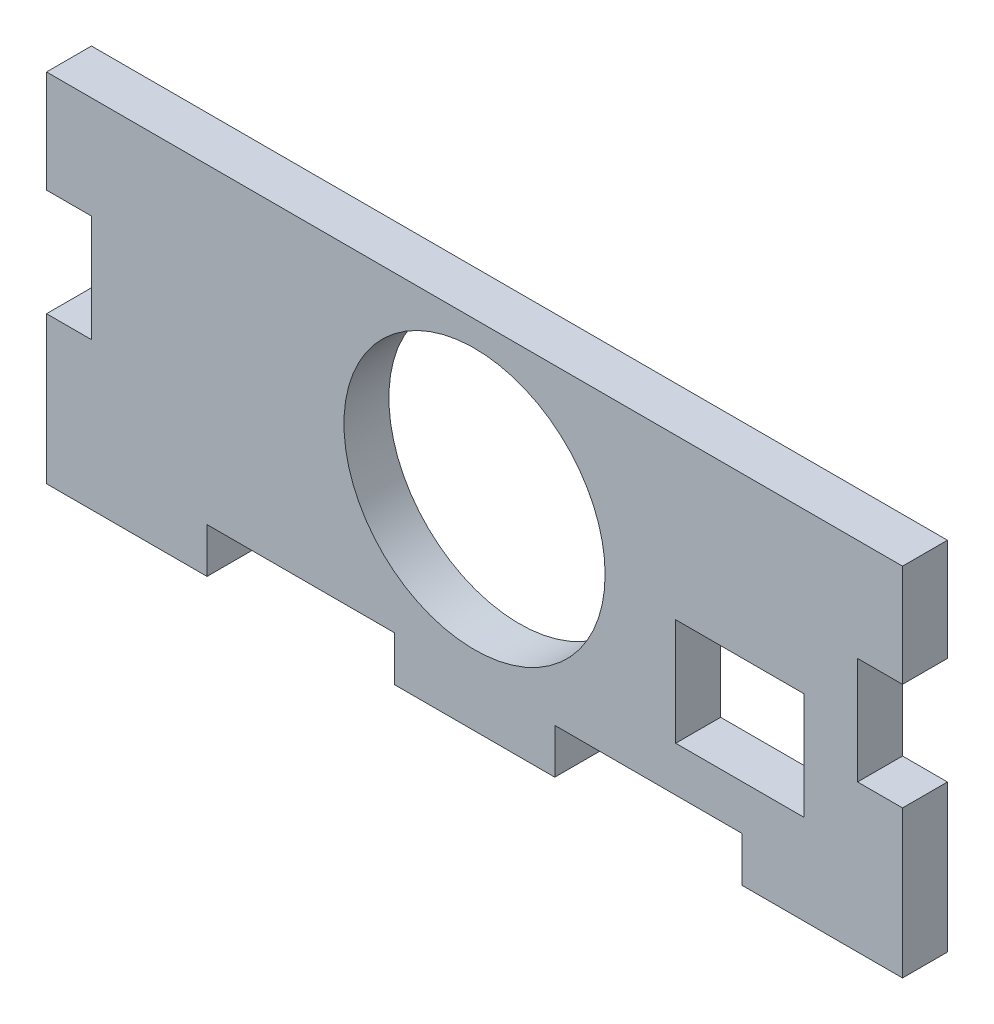
ISO-10303-21;
HEADER;
FILE_DESCRIPTION(('STEP AP214'),'2;1');
FILE_NAME('part.step','',(''),(''),'','','');
FILE_SCHEMA(('AUTOMOTIVE_DESIGN { 1 0 10303 214 1 1 1 1 }'));
ENDSEC;
DATA;
#1=APPLICATION_CONTEXT('core data for automotive mechanical design processes');
#2=APPLICATION_PROTOCOL_DEFINITION('international standard','automotive_design',2000,#1);
#3=PRODUCT_CONTEXT('',#1,'mechanical');
#4=PRODUCT('Part','Part','',(#3));
#5=PRODUCT_RELATED_PRODUCT_CATEGORY('part','',(#4));
#6=PRODUCT_DEFINITION_FORMATION('','',#4);
#7=PRODUCT_DEFINITION_CONTEXT('part definition',#1,'design');
#8=PRODUCT_DEFINITION('design','',#6,#7);
#9=PRODUCT_DEFINITION_SHAPE('','',#8);
#10=(LENGTH_UNIT() NAMED_UNIT(*) SI_UNIT(.MILLI.,.METRE.));
#11=(NAMED_UNIT(*) PLANE_ANGLE_UNIT() SI_UNIT($,.RADIAN.));
#12=(NAMED_UNIT(*) SI_UNIT($,.STERADIAN.) SOLID_ANGLE_UNIT());
#13=UNCERTAINTY_MEASURE_WITH_UNIT(LENGTH_MEASURE(1.E-05),#10,'distance_accuracy_value','');
#14=(GEOMETRIC_REPRESENTATION_CONTEXT(3) GLOBAL_UNCERTAINTY_ASSIGNED_CONTEXT((#13)) GLOBAL_UNIT_ASSIGNED_CONTEXT((#10,
#11,#12)) REPRESENTATION_CONTEXT('',''));
#15=CARTESIAN_POINT('',(0.,0.,0.));
#16=DIRECTION('',(0.,0.,1.));
#17=DIRECTION('',(1.,0.,0.));
#18=AXIS2_PLACEMENT_3D('',#15,#16,#17);
#19=CARTESIAN_POINT('',(50.8,18.5,-5.334));
#20=DIRECTION('',(1.,0.,0.));
#21=DIRECTION('',(0.,1.,0.));
#22=AXIS2_PLACEMENT_3D('',#19,#20,#21);
#23=PLANE('',#22);
#24=DIRECTION('',(0.,0.,1.));
#25=VECTOR('',#24,1.);
#26=CARTESIAN_POINT('',(50.8,6.34999999999999,-5.33405));
#27=LINE('',#26,#25);
#28=CARTESIAN_POINT('',(50.8,6.34999999999999,-5.334));
#29=VERTEX_POINT('',#28);
#30=CARTESIAN_POINT('',(50.8,6.34999999999999,0.));
#31=VERTEX_POINT('',#30);
#32=EDGE_CURVE('E221',#29,#31,#27,.T.);
#33=ORIENTED_EDGE('',*,*,#32,.F.);
#34=DIRECTION('',(0.,1.,0.));
#35=VECTOR('',#34,1.);
#36=CARTESIAN_POINT('',(50.8,18.5,-5.334));
#37=LINE('',#36,#35);
#38=CARTESIAN_POINT('',(50.8,18.5,-5.334));
#39=VERTEX_POINT('',#38);
#40=EDGE_CURVE('E355',#29,#39,#37,.T.);
#41=ORIENTED_EDGE('',*,*,#40,.T.);
#42=DIRECTION('',(0.,0.,1.));
#43=VECTOR('',#42,1.);
#44=CARTESIAN_POINT('',(50.8,18.5,-5.334));
#45=LINE('',#44,#43);
#46=CARTESIAN_POINT('',(50.8,18.5,0.));
#47=VERTEX_POINT('',#46);
#48=EDGE_CURVE('E356',#39,#47,#45,.T.);
#49=ORIENTED_EDGE('',*,*,#48,.T.);
#50=DIRECTION('',(0.,1.,0.));
#51=VECTOR('',#50,1.);
#52=CARTESIAN_POINT('',(50.8,18.5,0.));
#53=LINE('',#52,#51);
#54=EDGE_CURVE('E387',#31,#47,#53,.T.);
#55=ORIENTED_EDGE('',*,*,#54,.F.);
#56=EDGE_LOOP('',(#33,#41,#49,#55));
#57=FACE_BOUND('',#56,.T.);
#58=ADVANCED_FACE('F32',(#57),#23,.T.);
#59=CARTESIAN_POINT('',(-50.8,18.5,-5.334));
#60=DIRECTION('',(-1.,0.,0.));
#61=DIRECTION('',(0.,0.,1.));
#62=AXIS2_PLACEMENT_3D('',#59,#60,#61);
#63=PLANE('',#62);
#64=DIRECTION('',(0.,0.,1.));
#65=VECTOR('',#64,1.);
#66=CARTESIAN_POINT('',(-50.8,6.34999999999999,-5.33405));
#67=LINE('',#66,#65);
#68=CARTESIAN_POINT('',(-50.8,6.34999999999999,-5.334));
#69=VERTEX_POINT('',#68);
#70=CARTESIAN_POINT('',(-50.8,6.34999999999999,0.));
#71=VERTEX_POINT('',#70);
#72=EDGE_CURVE('E248',#69,#71,#67,.T.);
#73=ORIENTED_EDGE('',*,*,#72,.T.);
#74=DIRECTION('',(0.,-1.,0.));
#75=VECTOR('',#74,1.);
#76=CARTESIAN_POINT('',(-50.8,18.5,0.));
#77=LINE('',#76,#75);
#78=CARTESIAN_POINT('',(-50.8,18.5,0.));
#79=VERTEX_POINT('',#78);
#80=EDGE_CURVE('E344',#79,#71,#77,.T.);
#81=ORIENTED_EDGE('',*,*,#80,.F.);
#82=DIRECTION('',(0.,0.,1.));
#83=VECTOR('',#82,1.);
#84=CARTESIAN_POINT('',(-50.8,18.5,-5.334));
#85=LINE('',#84,#83);
#86=CARTESIAN_POINT('',(-50.8,18.5,-5.334));
#87=VERTEX_POINT('',#86);
#88=EDGE_CURVE('E351',#87,#79,#85,.T.);
#89=ORIENTED_EDGE('',*,*,#88,.F.);
#90=DIRECTION('',(0.,-1.,0.));
#91=VECTOR('',#90,1.);
#92=CARTESIAN_POINT('',(-50.8,18.5,-5.334));
#93=LINE('',#92,#91);
#94=EDGE_CURVE('E368',#87,#69,#93,.T.);
#95=ORIENTED_EDGE('',*,*,#94,.T.);
#96=EDGE_LOOP('',(#73,#81,#89,#95));
#97=FACE_BOUND('',#96,.T.);
#98=ADVANCED_FACE('F401',(#97),#63,.T.);
#99=CARTESIAN_POINT('',(-50.8,-18.5,-5.334));
#100=DIRECTION('',(0.,-1.,0.));
#101=DIRECTION('',(1.,0.,0.));
#102=AXIS2_PLACEMENT_3D('',#99,#100,#101);
#103=PLANE('',#102);
#104=DIRECTION('',(1.,0.,0.));
#105=VECTOR('',#104,1.);
#106=CARTESIAN_POINT('',(-50.8,-18.5,-5.334));
#107=LINE('',#106,#105);
#108=CARTESIAN_POINT('',(9.525,-18.5,-5.334));
#109=VERTEX_POINT('',#108);
#110=CARTESIAN_POINT('',(31.75,-18.5,-5.33399999999999));
#111=VERTEX_POINT('',#110);
#112=EDGE_CURVE('E345',#109,#111,#107,.T.);
#113=ORIENTED_EDGE('',*,*,#112,.T.);
#114=DIRECTION('',(0.,0.,-1.));
#115=VECTOR('',#114,1.);
#116=CARTESIAN_POINT('',(31.75,-18.5,0.));
#117=LINE('',#116,#115);
#118=CARTESIAN_POINT('',(31.75,-18.5,0.));
#119=VERTEX_POINT('',#118);
#120=EDGE_CURVE('E265',#119,#111,#117,.T.);
#121=ORIENTED_EDGE('',*,*,#120,.F.);
#122=DIRECTION('',(1.,0.,0.));
#123=VECTOR('',#122,1.);
#124=CARTESIAN_POINT('',(-50.8,-18.5,0.));
#125=LINE('',#124,#123);
#126=CARTESIAN_POINT('',(9.52499999999998,-18.5,0.));
#127=VERTEX_POINT('',#126);
#128=EDGE_CURVE('E339',#127,#119,#125,.T.);
#129=ORIENTED_EDGE('',*,*,#128,.F.);
#130=DIRECTION('',(0.,0.,1.));
#131=VECTOR('',#130,1.);
#132=CARTESIAN_POINT('',(9.525,-18.5,0.));
#133=LINE('',#132,#131);
#134=EDGE_CURVE('E288',#109,#127,#133,.T.);
#135=ORIENTED_EDGE('',*,*,#134,.F.);
#136=EDGE_LOOP('',(#113,#121,#129,#135));
#137=FACE_BOUND('',#136,.T.);
#138=ADVANCED_FACE('F442',(#137),#103,.T.);
#139=CARTESIAN_POINT('',(-31.75,-18.5,-5.334));
#140=VERTEX_POINT('',#139);
#141=CARTESIAN_POINT('',(-9.525,-18.5,-5.334));
#142=VERTEX_POINT('',#141);
#143=EDGE_CURVE('E326',#140,#142,#107,.T.);
#144=ORIENTED_EDGE('',*,*,#143,.T.);
#145=DIRECTION('',(0.,0.,-1.));
#146=VECTOR('',#145,1.);
#147=CARTESIAN_POINT('',(-9.525,-18.5,0.));
#148=LINE('',#147,#146);
#149=CARTESIAN_POINT('',(-9.525,-18.5,0.));
#150=VERTEX_POINT('',#149);
#151=EDGE_CURVE('E283',#150,#142,#148,.T.);
#152=ORIENTED_EDGE('',*,*,#151,.F.);
#153=CARTESIAN_POINT('',(-31.75,-18.5,0.));
#154=VERTEX_POINT('',#153);
#155=EDGE_CURVE('E343',#154,#150,#125,.T.);
#156=ORIENTED_EDGE('',*,*,#155,.F.);
#157=DIRECTION('',(0.,0.,1.));
#158=VECTOR('',#157,1.);
#159=CARTESIAN_POINT('',(-31.75,-18.5,0.));
#160=LINE('',#159,#158);
#161=EDGE_CURVE('E306',#140,#154,#160,.T.);
#162=ORIENTED_EDGE('',*,*,#161,.F.);
#163=EDGE_LOOP('',(#144,#152,#156,#162));
#164=FACE_BOUND('',#163,.T.);
#165=ADVANCED_FACE('F428',(#164),#103,.T.);
#166=DIRECTION('',(0.,0.,1.));
#167=VECTOR('',#166,1.);
#168=CARTESIAN_POINT('',(50.8,-6.35,-5.33405));
#169=LINE('',#168,#167);
#170=CARTESIAN_POINT('',(50.8,-6.35,-5.334));
#171=VERTEX_POINT('',#170);
#172=CARTESIAN_POINT('',(50.8,-6.35,0.));
#173=VERTEX_POINT('',#172);
#174=EDGE_CURVE('E224',#171,#173,#169,.T.);
#175=ORIENTED_EDGE('',*,*,#174,.T.);
#176=CARTESIAN_POINT('',(50.8,-23.834,0.));
#177=VERTEX_POINT('',#176);
#178=EDGE_CURVE('E383',#177,#173,#53,.T.);
#179=ORIENTED_EDGE('',*,*,#178,.F.);
#180=DIRECTION('',(0.,0.,1.));
#181=VECTOR('',#180,1.);
#182=CARTESIAN_POINT('',(50.8,-23.834,0.));
#183=LINE('',#182,#181);
#184=CARTESIAN_POINT('',(50.8,-23.834,-5.33399999999999));
#185=VERTEX_POINT('',#184);
#186=EDGE_CURVE('E274',#185,#177,#183,.T.);
#187=ORIENTED_EDGE('',*,*,#186,.F.);
#188=EDGE_CURVE('E454',#185,#171,#37,.T.);
#189=ORIENTED_EDGE('',*,*,#188,.T.);
#190=EDGE_LOOP('',(#175,#179,#187,#189));
#191=FACE_BOUND('',#190,.T.);
#192=ADVANCED_FACE('F34',(#191),#23,.T.);
#193=DIRECTION('',(0.,0.,1.));
#194=VECTOR('',#193,1.);
#195=CARTESIAN_POINT('',(-50.8,-6.35,-5.33405));
#196=LINE('',#195,#194);
#197=CARTESIAN_POINT('',(-50.8,-6.35,-5.334));
#198=VERTEX_POINT('',#197);
#199=CARTESIAN_POINT('',(-50.8,-6.35,0.));
#200=VERTEX_POINT('',#199);
#201=EDGE_CURVE('E247',#198,#200,#196,.T.);
#202=ORIENTED_EDGE('',*,*,#201,.F.);
#203=CARTESIAN_POINT('',(-50.8,-23.834,-5.334));
#204=VERTEX_POINT('',#203);
#205=EDGE_CURVE('E374',#198,#204,#93,.T.);
#206=ORIENTED_EDGE('',*,*,#205,.T.);
#207=DIRECTION('',(0.,0.,-1.));
#208=VECTOR('',#207,1.);
#209=CARTESIAN_POINT('',(-50.8,-23.834,0.));
#210=LINE('',#209,#208);
#211=CARTESIAN_POINT('',(-50.8,-23.834,0.));
#212=VERTEX_POINT('',#211);
#213=EDGE_CURVE('E307',#212,#204,#210,.T.);
#214=ORIENTED_EDGE('',*,*,#213,.F.);
#215=EDGE_CURVE('E389',#200,#212,#77,.T.);
#216=ORIENTED_EDGE('',*,*,#215,.F.);
#217=EDGE_LOOP('',(#202,#206,#214,#216));
#218=FACE_BOUND('',#217,.T.);
#219=ADVANCED_FACE('F418',(#218),#63,.T.);
#220=CARTESIAN_POINT('',(-50.8,18.5,-5.334));
#221=DIRECTION('',(0.,1.,0.));
#222=DIRECTION('',(0.,0.,1.));
#223=AXIS2_PLACEMENT_3D('',#220,#221,#222);
#224=PLANE('',#223);
#225=DIRECTION('',(-1.,0.,0.));
#226=VECTOR('',#225,1.);
#227=CARTESIAN_POINT('',(-50.8,18.5,0.));
#228=LINE('',#227,#226);
#229=EDGE_CURVE('E386',#47,#79,#228,.T.);
#230=ORIENTED_EDGE('',*,*,#229,.F.);
#231=ORIENTED_EDGE('',*,*,#48,.F.);
#232=DIRECTION('',(-1.,0.,0.));
#233=VECTOR('',#232,1.);
#234=CARTESIAN_POINT('',(-50.8,18.5,-5.334));
#235=LINE('',#234,#233);
#236=EDGE_CURVE('E378',#39,#87,#235,.T.);
#237=ORIENTED_EDGE('',*,*,#236,.T.);
#238=ORIENTED_EDGE('',*,*,#88,.T.);
#239=EDGE_LOOP('',(#230,#231,#237,#238));
#240=FACE_BOUND('',#239,.T.);
#241=ADVANCED_FACE('F481',(#240),#224,.T.);
#242=CARTESIAN_POINT('',(0.,0.,-5.334));
#243=DIRECTION('',(0.,0.,1.));
#244=DIRECTION('',(1.,0.,0.));
#245=AXIS2_PLACEMENT_3D('',#242,#243,#244);
#246=PLANE('',#245);
#247=DIRECTION('',(-1.,0.,0.));
#248=VECTOR('',#247,1.);
#249=CARTESIAN_POINT('',(0.,-0.466000000000012,-5.334));
#250=LINE('',#249,#248);
#251=CARTESIAN_POINT('',(39.116,-0.466000000000012,-5.334));
#252=VERTEX_POINT('',#251);
#253=CARTESIAN_POINT('',(23.876,-0.466000000000012,-5.334));
#254=VERTEX_POINT('',#253);
#255=EDGE_CURVE('E208',#252,#254,#250,.T.);
#256=ORIENTED_EDGE('',*,*,#255,.T.);
#257=DIRECTION('',(0.,-1.,0.));
#258=VECTOR('',#257,1.);
#259=CARTESIAN_POINT('',(23.876,0.,-5.334));
#260=LINE('',#259,#258);
#261=CARTESIAN_POINT('',(23.876,-13.166,-5.334));
#262=VERTEX_POINT('',#261);
#263=EDGE_CURVE('E200',#254,#262,#260,.T.);
#264=ORIENTED_EDGE('',*,*,#263,.T.);
#265=DIRECTION('',(1.,0.,0.));
#266=VECTOR('',#265,1.);
#267=CARTESIAN_POINT('',(0.,-13.166,-5.334));
#268=LINE('',#267,#266);
#269=CARTESIAN_POINT('',(39.116,-13.166,-5.334));
#270=VERTEX_POINT('',#269);
#271=EDGE_CURVE('E189',#262,#270,#268,.T.);
#272=ORIENTED_EDGE('',*,*,#271,.T.);
#273=DIRECTION('',(0.,1.,0.));
#274=VECTOR('',#273,1.);
#275=CARTESIAN_POINT('',(39.116,0.,-5.334));
#276=LINE('',#275,#274);
#277=EDGE_CURVE('E194',#270,#252,#276,.T.);
#278=ORIENTED_EDGE('',*,*,#277,.T.);
#279=EDGE_LOOP('',(#256,#264,#272,#278));
#280=FACE_BOUND('',#279,.T.);
#281=ORIENTED_EDGE('',*,*,#40,.F.);
#282=DIRECTION('',(-1.,0.,0.));
#283=VECTOR('',#282,1.);
#284=CARTESIAN_POINT('',(0.,6.35000000000001,-5.334));
#285=LINE('',#284,#283);
#286=CARTESIAN_POINT('',(45.466,6.34999999999999,-5.334));
#287=VERTEX_POINT('',#286);
#288=EDGE_CURVE('E236',#29,#287,#285,.T.);
#289=ORIENTED_EDGE('',*,*,#288,.T.);
#290=DIRECTION('',(0.,-1.,0.));
#291=VECTOR('',#290,1.);
#292=CARTESIAN_POINT('',(45.466,0.,-5.334));
#293=LINE('',#292,#291);
#294=CARTESIAN_POINT('',(45.466,-6.35,-5.334));
#295=VERTEX_POINT('',#294);
#296=EDGE_CURVE('E223',#287,#295,#293,.T.);
#297=ORIENTED_EDGE('',*,*,#296,.T.);
#298=DIRECTION('',(1.,0.,0.));
#299=VECTOR('',#298,1.);
#300=CARTESIAN_POINT('',(0.,-6.35,-5.334));
#301=LINE('',#300,#299);
#302=EDGE_CURVE('E233',#295,#171,#301,.T.);
#303=ORIENTED_EDGE('',*,*,#302,.T.);
#304=ORIENTED_EDGE('',*,*,#188,.F.);
#305=DIRECTION('',(1.,0.,0.));
#306=VECTOR('',#305,1.);
#307=CARTESIAN_POINT('',(50.8,-23.834,-5.33399999999999));
#308=LINE('',#307,#306);
#309=CARTESIAN_POINT('',(31.75,-23.834,-5.33399999999999));
#310=VERTEX_POINT('',#309);
#311=EDGE_CURVE('E271',#310,#185,#308,.T.);
#312=ORIENTED_EDGE('',*,*,#311,.F.);
#313=DIRECTION('',(0.,1.,0.));
#314=VECTOR('',#313,1.);
#315=CARTESIAN_POINT('',(31.75,-23.834,-5.33399999999999));
#316=LINE('',#315,#314);
#317=EDGE_CURVE('E277',#310,#111,#316,.T.);
#318=ORIENTED_EDGE('',*,*,#317,.T.);
#319=ORIENTED_EDGE('',*,*,#112,.F.);
#320=DIRECTION('',(0.,1.,0.));
#321=VECTOR('',#320,1.);
#322=CARTESIAN_POINT('',(9.525,-23.834,-5.334));
#323=LINE('',#322,#321);
#324=CARTESIAN_POINT('',(9.525,-23.834,-5.334));
#325=VERTEX_POINT('',#324);
#326=EDGE_CURVE('E302',#325,#109,#323,.T.);
#327=ORIENTED_EDGE('',*,*,#326,.F.);
#328=DIRECTION('',(1.,0.,0.));
#329=VECTOR('',#328,1.);
#330=CARTESIAN_POINT('',(-9.525,-23.834,-5.334));
#331=LINE('',#330,#329);
#332=CARTESIAN_POINT('',(-9.525,-23.834,-5.334));
#333=VERTEX_POINT('',#332);
#334=EDGE_CURVE('E287',#333,#325,#331,.T.);
#335=ORIENTED_EDGE('',*,*,#334,.F.);
#336=DIRECTION('',(0.,1.,0.));
#337=VECTOR('',#336,1.);
#338=CARTESIAN_POINT('',(-9.525,-23.834,-5.334));
#339=LINE('',#338,#337);
#340=EDGE_CURVE('E304',#333,#142,#339,.T.);
#341=ORIENTED_EDGE('',*,*,#340,.T.);
#342=ORIENTED_EDGE('',*,*,#143,.F.);
#343=DIRECTION('',(0.,1.,0.));
#344=VECTOR('',#343,1.);
#345=CARTESIAN_POINT('',(-31.75,-23.834,-5.334));
#346=LINE('',#345,#344);
#347=CARTESIAN_POINT('',(-31.75,-23.834,-5.334));
#348=VERTEX_POINT('',#347);
#349=EDGE_CURVE('E331',#348,#140,#346,.T.);
#350=ORIENTED_EDGE('',*,*,#349,.F.);
#351=DIRECTION('',(1.,0.,0.));
#352=VECTOR('',#351,1.);
#353=CARTESIAN_POINT('',(-50.8,-23.834,-5.334));
#354=LINE('',#353,#352);
#355=EDGE_CURVE('E310',#204,#348,#354,.T.);
#356=ORIENTED_EDGE('',*,*,#355,.F.);
#357=ORIENTED_EDGE('',*,*,#205,.F.);
#358=DIRECTION('',(1.,0.,0.));
#359=VECTOR('',#358,1.);
#360=CARTESIAN_POINT('',(0.,-6.35,-5.334));
#361=LINE('',#360,#359);
#362=CARTESIAN_POINT('',(-45.466,-6.35,-5.334));
#363=VERTEX_POINT('',#362);
#364=EDGE_CURVE('E251',#198,#363,#361,.T.);
#365=ORIENTED_EDGE('',*,*,#364,.T.);
#366=DIRECTION('',(0.,1.,0.));
#367=VECTOR('',#366,1.);
#368=CARTESIAN_POINT('',(-45.466,0.,-5.334));
#369=LINE('',#368,#367);
#370=CARTESIAN_POINT('',(-45.466,6.34999999999999,-5.334));
#371=VERTEX_POINT('',#370);
#372=EDGE_CURVE('E259',#363,#371,#369,.T.);
#373=ORIENTED_EDGE('',*,*,#372,.T.);
#374=DIRECTION('',(-1.,0.,0.));
#375=VECTOR('',#374,1.);
#376=CARTESIAN_POINT('',(0.,6.35000000000001,-5.334));
#377=LINE('',#376,#375);
#378=EDGE_CURVE('E262',#371,#69,#377,.T.);
#379=ORIENTED_EDGE('',*,*,#378,.T.);
#380=ORIENTED_EDGE('',*,*,#94,.F.);
#381=ORIENTED_EDGE('',*,*,#236,.F.);
#382=EDGE_LOOP('',(#281,#289,#297,#303,#304,#312,#318,#319,#327,#335,#341,#342,#350,#356,#357,
#365,#373,#379,#380,#381));
#383=FACE_BOUND('',#382,.T.);
#384=CARTESIAN_POINT('',(0.,0.,-5.334));
#385=DIRECTION('',(0.,0.,1.));
#386=DIRECTION('',(1.,0.,0.));
#387=AXIS2_PLACEMENT_3D('',#384,#385,#386);
#388=CIRCLE('',#387,15.5);
#389=CARTESIAN_POINT('',(15.5,0.,-5.334));
#390=VERTEX_POINT('',#389);
#391=EDGE_CURVE('E320',#390,#390,#388,.T.);
#392=ORIENTED_EDGE('',*,*,#391,.T.);
#393=EDGE_LOOP('',(#392));
#394=FACE_BOUND('',#393,.T.);
#395=ADVANCED_FACE('F206',(#280,#383,#394),#246,.F.);
#396=CARTESIAN_POINT('',(0.,0.,0.));
#397=DIRECTION('',(0.,0.,1.));
#398=DIRECTION('',(1.,0.,0.));
#399=AXIS2_PLACEMENT_3D('',#396,#397,#398);
#400=PLANE('',#399);
#401=DIRECTION('',(0.,-1.,0.));
#402=VECTOR('',#401,1.);
#403=CARTESIAN_POINT('',(23.876,0.,0.));
#404=LINE('',#403,#402);
#405=CARTESIAN_POINT('',(23.876,-0.466000000000012,0.));
#406=VERTEX_POINT('',#405);
#407=CARTESIAN_POINT('',(23.876,-13.166,0.));
#408=VERTEX_POINT('',#407);
#409=EDGE_CURVE('E11',#406,#408,#404,.T.);
#410=ORIENTED_EDGE('',*,*,#409,.F.);
#411=DIRECTION('',(-1.,0.,0.));
#412=VECTOR('',#411,1.);
#413=CARTESIAN_POINT('',(0.,-0.466000000000012,0.));
#414=LINE('',#413,#412);
#415=CARTESIAN_POINT('',(39.116,-0.466000000000012,0.));
#416=VERTEX_POINT('',#415);
#417=EDGE_CURVE('E40',#416,#406,#414,.T.);
#418=ORIENTED_EDGE('',*,*,#417,.F.);
#419=DIRECTION('',(0.,1.,0.));
#420=VECTOR('',#419,1.);
#421=CARTESIAN_POINT('',(39.116,0.,0.));
#422=LINE('',#421,#420);
#423=CARTESIAN_POINT('',(39.116,-13.166,0.));
#424=VERTEX_POINT('',#423);
#425=EDGE_CURVE('E547',#424,#416,#422,.T.);
#426=ORIENTED_EDGE('',*,*,#425,.F.);
#427=DIRECTION('',(1.,0.,0.));
#428=VECTOR('',#427,1.);
#429=CARTESIAN_POINT('',(0.,-13.166,0.));
#430=LINE('',#429,#428);
#431=EDGE_CURVE('E362',#408,#424,#430,.T.);
#432=ORIENTED_EDGE('',*,*,#431,.F.);
#433=EDGE_LOOP('',(#410,#418,#426,#432));
#434=FACE_BOUND('',#433,.T.);
#435=DIRECTION('',(-1.,0.,0.));
#436=VECTOR('',#435,1.);
#437=CARTESIAN_POINT('',(50.8,6.34999999999999,0.));
#438=LINE('',#437,#436);
#439=CARTESIAN_POINT('',(45.466,6.34999999999999,0.));
#440=VERTEX_POINT('',#439);
#441=EDGE_CURVE('E209',#31,#440,#438,.T.);
#442=ORIENTED_EDGE('',*,*,#441,.F.);
#443=ORIENTED_EDGE('',*,*,#54,.T.);
#444=ORIENTED_EDGE('',*,*,#229,.T.);
#445=ORIENTED_EDGE('',*,*,#80,.T.);
#446=DIRECTION('',(-1.,0.,0.));
#447=VECTOR('',#446,1.);
#448=CARTESIAN_POINT('',(-50.8,6.34999999999999,0.));
#449=LINE('',#448,#447);
#450=CARTESIAN_POINT('',(-45.466,6.34999999999999,0.));
#451=VERTEX_POINT('',#450);
#452=EDGE_CURVE('E245',#451,#71,#449,.T.);
#453=ORIENTED_EDGE('',*,*,#452,.F.);
#454=DIRECTION('',(0.,1.,0.));
#455=VECTOR('',#454,1.);
#456=CARTESIAN_POINT('',(-45.466,6.34999999999999,0.));
#457=LINE('',#456,#455);
#458=CARTESIAN_POINT('',(-45.466,-6.35,0.));
#459=VERTEX_POINT('',#458);
#460=EDGE_CURVE('E242',#459,#451,#457,.T.);
#461=ORIENTED_EDGE('',*,*,#460,.F.);
#462=DIRECTION('',(1.,0.,0.));
#463=VECTOR('',#462,1.);
#464=CARTESIAN_POINT('',(-50.8,-6.35,0.));
#465=LINE('',#464,#463);
#466=EDGE_CURVE('E239',#200,#459,#465,.T.);
#467=ORIENTED_EDGE('',*,*,#466,.F.);
#468=ORIENTED_EDGE('',*,*,#215,.T.);
#469=DIRECTION('',(-1.,0.,0.));
#470=VECTOR('',#469,1.);
#471=CARTESIAN_POINT('',(-50.8,-23.834,0.));
#472=LINE('',#471,#470);
#473=CARTESIAN_POINT('',(-31.75,-23.834,0.));
#474=VERTEX_POINT('',#473);
#475=EDGE_CURVE('E314',#474,#212,#472,.T.);
#476=ORIENTED_EDGE('',*,*,#475,.F.);
#477=DIRECTION('',(0.,1.,0.));
#478=VECTOR('',#477,1.);
#479=CARTESIAN_POINT('',(-31.75,-23.834,0.));
#480=LINE('',#479,#478);
#481=EDGE_CURVE('E317',#474,#154,#480,.T.);
#482=ORIENTED_EDGE('',*,*,#481,.T.);
#483=ORIENTED_EDGE('',*,*,#155,.T.);
#484=DIRECTION('',(0.,1.,0.));
#485=VECTOR('',#484,1.);
#486=CARTESIAN_POINT('',(-9.525,-23.834,0.));
#487=LINE('',#486,#485);
#488=CARTESIAN_POINT('',(-9.525,-23.834,0.));
#489=VERTEX_POINT('',#488);
#490=EDGE_CURVE('E294',#489,#150,#487,.T.);
#491=ORIENTED_EDGE('',*,*,#490,.F.);
#492=DIRECTION('',(-1.,0.,0.));
#493=VECTOR('',#492,1.);
#494=CARTESIAN_POINT('',(-9.525,-23.834,0.));
#495=LINE('',#494,#493);
#496=CARTESIAN_POINT('',(9.525,-23.834,0.));
#497=VERTEX_POINT('',#496);
#498=EDGE_CURVE('E292',#497,#489,#495,.T.);
#499=ORIENTED_EDGE('',*,*,#498,.F.);
#500=DIRECTION('',(0.,1.,0.));
#501=VECTOR('',#500,1.);
#502=CARTESIAN_POINT('',(9.525,-23.834,0.));
#503=LINE('',#502,#501);
#504=EDGE_CURVE('E300',#497,#127,#503,.T.);
#505=ORIENTED_EDGE('',*,*,#504,.T.);
#506=ORIENTED_EDGE('',*,*,#128,.T.);
#507=DIRECTION('',(0.,1.,0.));
#508=VECTOR('',#507,1.);
#509=CARTESIAN_POINT('',(31.75,-23.834,0.));
#510=LINE('',#509,#508);
#511=CARTESIAN_POINT('',(31.75,-23.834,0.));
#512=VERTEX_POINT('',#511);
#513=EDGE_CURVE('E281',#512,#119,#510,.T.);
#514=ORIENTED_EDGE('',*,*,#513,.F.);
#515=DIRECTION('',(-1.,0.,0.));
#516=VECTOR('',#515,1.);
#517=CARTESIAN_POINT('',(50.8,-23.834,0.));
#518=LINE('',#517,#516);
#519=EDGE_CURVE('E266',#177,#512,#518,.T.);
#520=ORIENTED_EDGE('',*,*,#519,.F.);
#521=ORIENTED_EDGE('',*,*,#178,.T.);
#522=DIRECTION('',(1.,0.,0.));
#523=VECTOR('',#522,1.);
#524=CARTESIAN_POINT('',(50.8,-6.35,0.));
#525=LINE('',#524,#523);
#526=CARTESIAN_POINT('',(45.466,-6.35,0.));
#527=VERTEX_POINT('',#526);
#528=EDGE_CURVE('E218',#527,#173,#525,.T.);
#529=ORIENTED_EDGE('',*,*,#528,.F.);
#530=DIRECTION('',(0.,-1.,0.));
#531=VECTOR('',#530,1.);
#532=CARTESIAN_POINT('',(45.466,6.34999999999999,0.));
#533=LINE('',#532,#531);
#534=EDGE_CURVE('E211',#440,#527,#533,.T.);
#535=ORIENTED_EDGE('',*,*,#534,.F.);
#536=EDGE_LOOP('',(#442,#443,#444,#445,#453,#461,#467,#468,#476,#482,#483,#491,#499,#505,#506,
#514,#520,#521,#529,#535));
#537=FACE_BOUND('',#536,.T.);
#538=CARTESIAN_POINT('',(0.,0.,0.));
#539=DIRECTION('',(0.,0.,1.));
#540=DIRECTION('',(1.,0.,0.));
#541=AXIS2_PLACEMENT_3D('',#538,#539,#540);
#542=CIRCLE('',#541,15.5);
#543=CARTESIAN_POINT('',(15.5,0.,0.));
#544=VERTEX_POINT('',#543);
#545=EDGE_CURVE('E336',#544,#544,#542,.T.);
#546=ORIENTED_EDGE('',*,*,#545,.F.);
#547=EDGE_LOOP('',(#546));
#548=FACE_BOUND('',#547,.T.);
#549=ADVANCED_FACE('F398',(#434,#537,#548),#400,.T.);
#550=CARTESIAN_POINT('',(0.,0.,-5.334));
#551=DIRECTION('',(0.,0.,1.));
#552=DIRECTION('',(1.,0.,0.));
#553=AXIS2_PLACEMENT_3D('',#550,#551,#552);
#554=CYLINDRICAL_SURFACE('',#553,15.5);
#555=ORIENTED_EDGE('',*,*,#391,.F.);
#556=EDGE_LOOP('',(#555));
#557=FACE_BOUND('',#556,.T.);
#558=ORIENTED_EDGE('',*,*,#545,.T.);
#559=EDGE_LOOP('',(#558));
#560=FACE_BOUND('',#559,.T.);
#561=ADVANCED_FACE('F496',(#557,#560),#554,.F.);
#562=CARTESIAN_POINT('',(-31.75,-23.834,0.));
#563=DIRECTION('',(-1.,0.,0.));
#564=DIRECTION('',(0.,0.,1.));
#565=AXIS2_PLACEMENT_3D('',#562,#563,#564);
#566=PLANE('',#565);
#567=ORIENTED_EDGE('',*,*,#161,.T.);
#568=ORIENTED_EDGE('',*,*,#481,.F.);
#569=DIRECTION('',(0.,0.,1.));
#570=VECTOR('',#569,1.);
#571=CARTESIAN_POINT('',(-31.75,-23.834,0.));
#572=LINE('',#571,#570);
#573=EDGE_CURVE('E312',#348,#474,#572,.T.);
#574=ORIENTED_EDGE('',*,*,#573,.F.);
#575=ORIENTED_EDGE('',*,*,#349,.T.);
#576=EDGE_LOOP('',(#567,#568,#574,#575));
#577=FACE_BOUND('',#576,.T.);
#578=ADVANCED_FACE('F427',(#577),#566,.F.);
#579=CARTESIAN_POINT('',(0.,-23.834,0.));
#580=DIRECTION('',(0.,-1.,0.));
#581=DIRECTION('',(0.,0.,-1.));
#582=AXIS2_PLACEMENT_3D('',#579,#580,#581);
#583=PLANE('',#582);
#584=ORIENTED_EDGE('',*,*,#213,.T.);
#585=ORIENTED_EDGE('',*,*,#355,.T.);
#586=ORIENTED_EDGE('',*,*,#573,.T.);
#587=ORIENTED_EDGE('',*,*,#475,.T.);
#588=EDGE_LOOP('',(#584,#585,#586,#587));
#589=FACE_BOUND('',#588,.T.);
#590=ADVANCED_FACE('F421',(#589),#583,.T.);
#591=CARTESIAN_POINT('',(-9.525,-23.834,0.));
#592=DIRECTION('',(1.,0.,0.));
#593=DIRECTION('',(0.,0.,-1.));
#594=AXIS2_PLACEMENT_3D('',#591,#592,#593);
#595=PLANE('',#594);
#596=ORIENTED_EDGE('',*,*,#151,.T.);
#597=ORIENTED_EDGE('',*,*,#340,.F.);
#598=DIRECTION('',(0.,0.,-1.));
#599=VECTOR('',#598,1.);
#600=CARTESIAN_POINT('',(-9.525,-23.834,0.));
#601=LINE('',#600,#599);
#602=EDGE_CURVE('E284',#489,#333,#601,.T.);
#603=ORIENTED_EDGE('',*,*,#602,.F.);
#604=ORIENTED_EDGE('',*,*,#490,.T.);
#605=EDGE_LOOP('',(#596,#597,#603,#604));
#606=FACE_BOUND('',#605,.T.);
#607=ADVANCED_FACE('F433',(#606),#595,.F.);
#608=CARTESIAN_POINT('',(9.525,-23.834,0.));
#609=DIRECTION('',(-1.,0.,0.));
#610=DIRECTION('',(0.,0.,1.));
#611=AXIS2_PLACEMENT_3D('',#608,#609,#610);
#612=PLANE('',#611);
#613=ORIENTED_EDGE('',*,*,#134,.T.);
#614=ORIENTED_EDGE('',*,*,#504,.F.);
#615=DIRECTION('',(0.,0.,1.));
#616=VECTOR('',#615,1.);
#617=CARTESIAN_POINT('',(9.525,-23.834,0.));
#618=LINE('',#617,#616);
#619=EDGE_CURVE('E290',#325,#497,#618,.T.);
#620=ORIENTED_EDGE('',*,*,#619,.F.);
#621=ORIENTED_EDGE('',*,*,#326,.T.);
#622=EDGE_LOOP('',(#613,#614,#620,#621));
#623=FACE_BOUND('',#622,.T.);
#624=ADVANCED_FACE('F440',(#623),#612,.F.);
#625=CARTESIAN_POINT('',(0.,-23.834,0.));
#626=DIRECTION('',(0.,-1.,0.));
#627=DIRECTION('',(0.,0.,-1.));
#628=AXIS2_PLACEMENT_3D('',#625,#626,#627);
#629=PLANE('',#628);
#630=ORIENTED_EDGE('',*,*,#602,.T.);
#631=ORIENTED_EDGE('',*,*,#334,.T.);
#632=ORIENTED_EDGE('',*,*,#619,.T.);
#633=ORIENTED_EDGE('',*,*,#498,.T.);
#634=EDGE_LOOP('',(#630,#631,#632,#633));
#635=FACE_BOUND('',#634,.T.);
#636=ADVANCED_FACE('F437',(#635),#629,.T.);
#637=CARTESIAN_POINT('',(31.75,-23.834,0.));
#638=DIRECTION('',(1.,0.,0.));
#639=DIRECTION('',(0.,0.,-1.));
#640=AXIS2_PLACEMENT_3D('',#637,#638,#639);
#641=PLANE('',#640);
#642=ORIENTED_EDGE('',*,*,#120,.T.);
#643=ORIENTED_EDGE('',*,*,#317,.F.);
#644=DIRECTION('',(0.,0.,-1.));
#645=VECTOR('',#644,1.);
#646=CARTESIAN_POINT('',(31.75,-23.834,0.));
#647=LINE('',#646,#645);
#648=EDGE_CURVE('E269',#512,#310,#647,.T.);
#649=ORIENTED_EDGE('',*,*,#648,.F.);
#650=ORIENTED_EDGE('',*,*,#513,.T.);
#651=EDGE_LOOP('',(#642,#643,#649,#650));
#652=FACE_BOUND('',#651,.T.);
#653=ADVANCED_FACE('F446',(#652),#641,.F.);
#654=CARTESIAN_POINT('',(0.,-23.834,0.));
#655=DIRECTION('',(0.,-1.,0.));
#656=DIRECTION('',(0.,0.,-1.));
#657=AXIS2_PLACEMENT_3D('',#654,#655,#656);
#658=PLANE('',#657);
#659=ORIENTED_EDGE('',*,*,#519,.T.);
#660=ORIENTED_EDGE('',*,*,#648,.T.);
#661=ORIENTED_EDGE('',*,*,#311,.T.);
#662=ORIENTED_EDGE('',*,*,#186,.T.);
#663=EDGE_LOOP('',(#659,#660,#661,#662));
#664=FACE_BOUND('',#663,.T.);
#665=ADVANCED_FACE('F450',(#664),#658,.T.);
#666=CARTESIAN_POINT('',(-50.8,6.34999999999999,-5.33405));
#667=DIRECTION('',(0.,1.,0.));
#668=DIRECTION('',(-1.,0.,0.));
#669=AXIS2_PLACEMENT_3D('',#666,#667,#668);
#670=PLANE('',#669);
#671=DIRECTION('',(0.,0.,1.));
#672=VECTOR('',#671,1.);
#673=CARTESIAN_POINT('',(-45.466,6.34999999999999,-5.33405));
#674=LINE('',#673,#672);
#675=EDGE_CURVE('E252',#371,#451,#674,.T.);
#676=ORIENTED_EDGE('',*,*,#675,.T.);
#677=ORIENTED_EDGE('',*,*,#452,.T.);
#678=ORIENTED_EDGE('',*,*,#72,.F.);
#679=ORIENTED_EDGE('',*,*,#378,.F.);
#680=EDGE_LOOP('',(#676,#677,#678,#679));
#681=FACE_BOUND('',#680,.T.);
#682=ADVANCED_FACE('F403',(#681),#670,.F.);
#683=CARTESIAN_POINT('',(-45.466,6.34999999999999,-5.33405));
#684=DIRECTION('',(1.,0.,0.));
#685=DIRECTION('',(0.,0.,-1.));
#686=AXIS2_PLACEMENT_3D('',#683,#684,#685);
#687=PLANE('',#686);
#688=DIRECTION('',(0.,0.,1.));
#689=VECTOR('',#688,1.);
#690=CARTESIAN_POINT('',(-45.466,-6.35,-5.33405));
#691=LINE('',#690,#689);
#692=EDGE_CURVE('E254',#363,#459,#691,.T.);
#693=ORIENTED_EDGE('',*,*,#692,.T.);
#694=ORIENTED_EDGE('',*,*,#460,.T.);
#695=ORIENTED_EDGE('',*,*,#675,.F.);
#696=ORIENTED_EDGE('',*,*,#372,.F.);
#697=EDGE_LOOP('',(#693,#694,#695,#696));
#698=FACE_BOUND('',#697,.T.);
#699=ADVANCED_FACE('F412',(#698),#687,.F.);
#700=CARTESIAN_POINT('',(-50.8,-6.35,-5.33405));
#701=DIRECTION('',(0.,-1.,0.));
#702=DIRECTION('',(0.,0.,-1.));
#703=AXIS2_PLACEMENT_3D('',#700,#701,#702);
#704=PLANE('',#703);
#705=ORIENTED_EDGE('',*,*,#201,.T.);
#706=ORIENTED_EDGE('',*,*,#466,.T.);
#707=ORIENTED_EDGE('',*,*,#692,.F.);
#708=ORIENTED_EDGE('',*,*,#364,.F.);
#709=EDGE_LOOP('',(#705,#706,#707,#708));
#710=FACE_BOUND('',#709,.T.);
#711=ADVANCED_FACE('F414',(#710),#704,.F.);
#712=CARTESIAN_POINT('',(50.8,6.34999999999999,-5.33405));
#713=DIRECTION('',(0.,1.,0.));
#714=DIRECTION('',(-1.,0.,0.));
#715=AXIS2_PLACEMENT_3D('',#712,#713,#714);
#716=PLANE('',#715);
#717=ORIENTED_EDGE('',*,*,#32,.T.);
#718=ORIENTED_EDGE('',*,*,#441,.T.);
#719=DIRECTION('',(0.,0.,1.));
#720=VECTOR('',#719,1.);
#721=CARTESIAN_POINT('',(45.466,6.34999999999999,-5.33405));
#722=LINE('',#721,#720);
#723=EDGE_CURVE('E220',#287,#440,#722,.T.);
#724=ORIENTED_EDGE('',*,*,#723,.F.);
#725=ORIENTED_EDGE('',*,*,#288,.F.);
#726=EDGE_LOOP('',(#717,#718,#724,#725));
#727=FACE_BOUND('',#726,.T.);
#728=ADVANCED_FACE('F464',(#727),#716,.F.);
#729=CARTESIAN_POINT('',(50.8,-6.35,-5.33405));
#730=DIRECTION('',(0.,-1.,0.));
#731=DIRECTION('',(0.,0.,-1.));
#732=AXIS2_PLACEMENT_3D('',#729,#730,#731);
#733=PLANE('',#732);
#734=DIRECTION('',(0.,0.,1.));
#735=VECTOR('',#734,1.);
#736=CARTESIAN_POINT('',(45.466,-6.35,-5.33405));
#737=LINE('',#736,#735);
#738=EDGE_CURVE('E227',#295,#527,#737,.T.);
#739=ORIENTED_EDGE('',*,*,#738,.T.);
#740=ORIENTED_EDGE('',*,*,#528,.T.);
#741=ORIENTED_EDGE('',*,*,#174,.F.);
#742=ORIENTED_EDGE('',*,*,#302,.F.);
#743=EDGE_LOOP('',(#739,#740,#741,#742));
#744=FACE_BOUND('',#743,.T.);
#745=ADVANCED_FACE('F458',(#744),#733,.F.);
#746=CARTESIAN_POINT('',(45.466,6.34999999999999,-5.33405));
#747=DIRECTION('',(-1.,0.,0.));
#748=DIRECTION('',(0.,0.,1.));
#749=AXIS2_PLACEMENT_3D('',#746,#747,#748);
#750=PLANE('',#749);
#751=ORIENTED_EDGE('',*,*,#723,.T.);
#752=ORIENTED_EDGE('',*,*,#534,.T.);
#753=ORIENTED_EDGE('',*,*,#738,.F.);
#754=ORIENTED_EDGE('',*,*,#296,.F.);
#755=EDGE_LOOP('',(#751,#752,#753,#754));
#756=FACE_BOUND('',#755,.T.);
#757=ADVANCED_FACE('F461',(#756),#750,.F.);
#758=CARTESIAN_POINT('',(23.876,-0.466000000000012,-5.33405));
#759=DIRECTION('',(-1.,0.,0.));
#760=DIRECTION('',(0.,-1.,0.));
#761=AXIS2_PLACEMENT_3D('',#758,#759,#760);
#762=PLANE('',#761);
#763=DIRECTION('',(0.,0.,1.));
#764=VECTOR('',#763,1.);
#765=CARTESIAN_POINT('',(23.876,-0.466000000000012,-5.33405));
#766=LINE('',#765,#764);
#767=EDGE_CURVE('E195',#254,#406,#766,.T.);
#768=ORIENTED_EDGE('',*,*,#767,.T.);
#769=ORIENTED_EDGE('',*,*,#409,.T.);
#770=DIRECTION('',(0.,0.,1.));
#771=VECTOR('',#770,1.);
#772=CARTESIAN_POINT('',(23.876,-13.166,-5.33405));
#773=LINE('',#772,#771);
#774=EDGE_CURVE('E52',#262,#408,#773,.T.);
#775=ORIENTED_EDGE('',*,*,#774,.F.);
#776=ORIENTED_EDGE('',*,*,#263,.F.);
#777=EDGE_LOOP('',(#768,#769,#775,#776));
#778=FACE_BOUND('',#777,.T.);
#779=ADVANCED_FACE('F199',(#778),#762,.F.);
#780=CARTESIAN_POINT('',(23.876,-0.466000000000012,-5.33405));
#781=DIRECTION('',(0.,1.,0.));
#782=DIRECTION('',(0.,0.,1.));
#783=AXIS2_PLACEMENT_3D('',#780,#781,#782);
#784=PLANE('',#783);
#785=DIRECTION('',(0.,0.,1.));
#786=VECTOR('',#785,1.);
#787=CARTESIAN_POINT('',(39.116,-0.466000000000012,-5.33405));
#788=LINE('',#787,#786);
#789=EDGE_CURVE('E543',#252,#416,#788,.T.);
#790=ORIENTED_EDGE('',*,*,#789,.T.);
#791=ORIENTED_EDGE('',*,*,#417,.T.);
#792=ORIENTED_EDGE('',*,*,#767,.F.);
#793=ORIENTED_EDGE('',*,*,#255,.F.);
#794=EDGE_LOOP('',(#790,#791,#792,#793));
#795=FACE_BOUND('',#794,.T.);
#796=ADVANCED_FACE('F530',(#795),#784,.F.);
#797=CARTESIAN_POINT('',(39.116,-0.466000000000012,-5.33405));
#798=DIRECTION('',(1.,0.,0.));
#799=DIRECTION('',(0.,1.,0.));
#800=AXIS2_PLACEMENT_3D('',#797,#798,#799);
#801=PLANE('',#800);
#802=DIRECTION('',(0.,0.,1.));
#803=VECTOR('',#802,1.);
#804=CARTESIAN_POINT('',(39.116,-13.166,-5.33405));
#805=LINE('',#804,#803);
#806=EDGE_CURVE('E47',#270,#424,#805,.T.);
#807=ORIENTED_EDGE('',*,*,#806,.T.);
#808=ORIENTED_EDGE('',*,*,#425,.T.);
#809=ORIENTED_EDGE('',*,*,#789,.F.);
#810=ORIENTED_EDGE('',*,*,#277,.F.);
#811=EDGE_LOOP('',(#807,#808,#809,#810));
#812=FACE_BOUND('',#811,.T.);
#813=ADVANCED_FACE('F533',(#812),#801,.F.);
#814=CARTESIAN_POINT('',(23.876,-13.166,-5.33405));
#815=DIRECTION('',(0.,-1.,0.));
#816=DIRECTION('',(0.,0.,-1.));
#817=AXIS2_PLACEMENT_3D('',#814,#815,#816);
#818=PLANE('',#817);
#819=ORIENTED_EDGE('',*,*,#774,.T.);
#820=ORIENTED_EDGE('',*,*,#431,.T.);
#821=ORIENTED_EDGE('',*,*,#806,.F.);
#822=ORIENTED_EDGE('',*,*,#271,.F.);
#823=EDGE_LOOP('',(#819,#820,#821,#822));
#824=FACE_BOUND('',#823,.T.);
#825=ADVANCED_FACE('F190',(#824),#818,.F.);
#826=CLOSED_SHELL('',(#58,#98,#138,#165,#192,#219,#241,#395,#549,#561,#578,#590,#607,#624,#636,
#653,#665,#682,#699,#711,#728,#745,#757,#779,#796,#813,#825));
#827=MANIFOLD_SOLID_BREP('B2',#826);
#828=ADVANCED_BREP_SHAPE_REPRESENTATION('',(#18,#827),#14);
#829=SHAPE_DEFINITION_REPRESENTATION(#9,#828);
ENDSEC;
END-ISO-10303-21;
